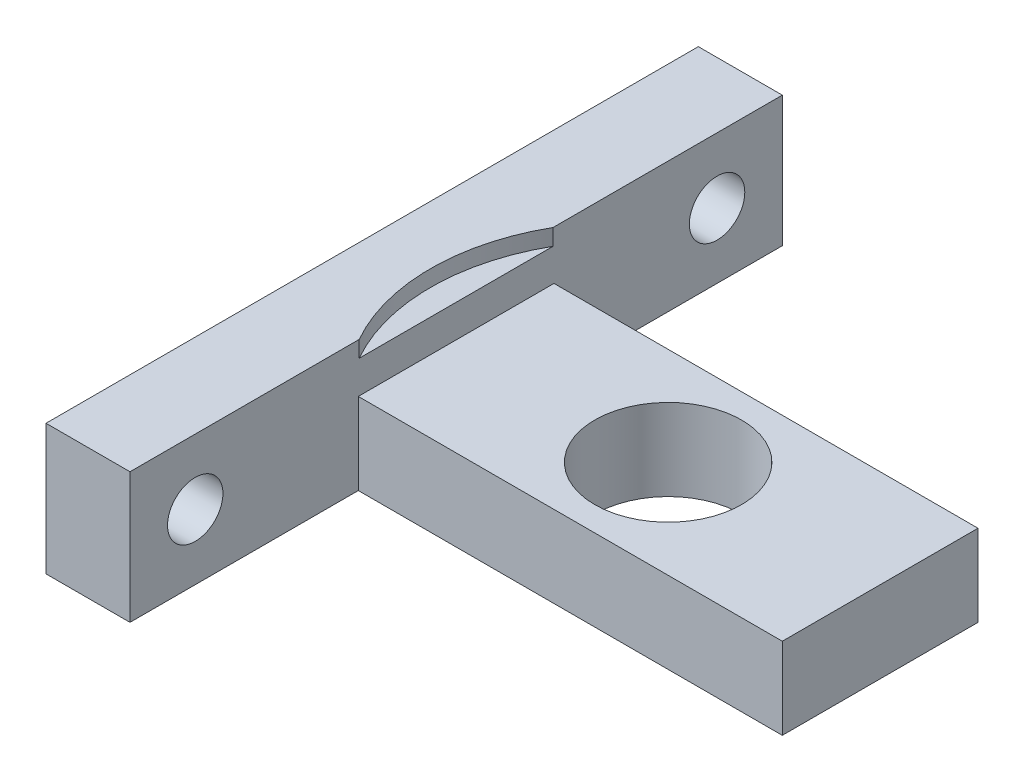
ISO-10303-21;
HEADER;
FILE_DESCRIPTION(('STEP AP214'),'2;1');
FILE_NAME('part.step','',(''),(''),'','','');
FILE_SCHEMA(('AUTOMOTIVE_DESIGN { 1 0 10303 214 1 1 1 1 }'));
ENDSEC;
DATA;
#1=APPLICATION_CONTEXT('core data for automotive mechanical design processes');
#2=APPLICATION_PROTOCOL_DEFINITION('international standard','automotive_design',2000,#1);
#3=PRODUCT_CONTEXT('',#1,'mechanical');
#4=PRODUCT('Part','Part','',(#3));
#5=PRODUCT_RELATED_PRODUCT_CATEGORY('part','',(#4));
#6=PRODUCT_DEFINITION_FORMATION('','',#4);
#7=PRODUCT_DEFINITION_CONTEXT('part definition',#1,'design');
#8=PRODUCT_DEFINITION('design','',#6,#7);
#9=PRODUCT_DEFINITION_SHAPE('','',#8);
#10=(LENGTH_UNIT() NAMED_UNIT(*) SI_UNIT(.MILLI.,.METRE.));
#11=(NAMED_UNIT(*) PLANE_ANGLE_UNIT() SI_UNIT($,.RADIAN.));
#12=(NAMED_UNIT(*) SI_UNIT($,.STERADIAN.) SOLID_ANGLE_UNIT());
#13=UNCERTAINTY_MEASURE_WITH_UNIT(LENGTH_MEASURE(1.E-05),#10,'distance_accuracy_value','');
#14=(GEOMETRIC_REPRESENTATION_CONTEXT(3) GLOBAL_UNCERTAINTY_ASSIGNED_CONTEXT((#13)) GLOBAL_UNIT_ASSIGNED_CONTEXT((#10,
#11,#12)) REPRESENTATION_CONTEXT('',''));
#15=CARTESIAN_POINT('',(0.,0.,0.));
#16=DIRECTION('',(0.,0.,1.));
#17=DIRECTION('',(1.,0.,0.));
#18=AXIS2_PLACEMENT_3D('',#15,#16,#17);
#19=CARTESIAN_POINT('',(-2.57499999999999,-8.00000000000001,20.));
#20=DIRECTION('',(-1.,0.,0.));
#21=DIRECTION('',(0.,0.,1.));
#22=AXIS2_PLACEMENT_3D('',#19,#20,#21);
#23=PLANE('',#22);
#24=CARTESIAN_POINT('',(-2.57499999999999,-4.,16.));
#25=DIRECTION('',(-1.,0.,0.));
#26=DIRECTION('',(0.,0.,1.));
#27=AXIS2_PLACEMENT_3D('',#24,#25,#26);
#28=CIRCLE('',#27,1.7);
#29=CARTESIAN_POINT('',(-2.57499999999999,-4.,17.7));
#30=VERTEX_POINT('',#29);
#31=EDGE_CURVE('E194',#30,#30,#28,.T.);
#32=ORIENTED_EDGE('',*,*,#31,.F.);
#33=EDGE_LOOP('',(#32));
#34=FACE_BOUND('',#33,.T.);
#35=CARTESIAN_POINT('',(-2.57499999999999,-4.,-16.));
#36=DIRECTION('',(-1.,0.,0.));
#37=DIRECTION('',(0.,0.,1.));
#38=AXIS2_PLACEMENT_3D('',#35,#36,#37);
#39=CIRCLE('',#38,1.7);
#40=CARTESIAN_POINT('',(-2.57499999999999,-4.,-14.3));
#41=VERTEX_POINT('',#40);
#42=EDGE_CURVE('E187',#41,#41,#39,.T.);
#43=ORIENTED_EDGE('',*,*,#42,.F.);
#44=EDGE_LOOP('',(#43));
#45=FACE_BOUND('',#44,.T.);
#46=DIRECTION('',(0.,0.,1.));
#47=VECTOR('',#46,1.);
#48=CARTESIAN_POINT('',(-2.57499999999999,0.,20.));
#49=LINE('',#48,#47);
#50=CARTESIAN_POINT('',(-2.57499999999999,0.,-20.));
#51=VERTEX_POINT('',#50);
#52=CARTESIAN_POINT('',(-2.57499999999999,0.,20.));
#53=VERTEX_POINT('',#52);
#54=EDGE_CURVE('E198',#51,#53,#49,.T.);
#55=ORIENTED_EDGE('',*,*,#54,.F.);
#56=DIRECTION('',(0.,1.,0.));
#57=VECTOR('',#56,1.);
#58=CARTESIAN_POINT('',(-2.57499999999999,-8.00000000000001,-20.));
#59=LINE('',#58,#57);
#60=CARTESIAN_POINT('',(-2.57499999999999,-8.00000000000001,-20.));
#61=VERTEX_POINT('',#60);
#62=EDGE_CURVE('E48',#61,#51,#59,.T.);
#63=ORIENTED_EDGE('',*,*,#62,.F.);
#64=DIRECTION('',(0.,0.,1.));
#65=VECTOR('',#64,1.);
#66=CARTESIAN_POINT('',(-2.57499999999999,-8.00000000000001,20.));
#67=LINE('',#66,#65);
#68=CARTESIAN_POINT('',(-2.57499999999999,-8.00000000000001,20.));
#69=VERTEX_POINT('',#68);
#70=EDGE_CURVE('E199',#61,#69,#67,.T.);
#71=ORIENTED_EDGE('',*,*,#70,.T.);
#72=DIRECTION('',(0.,1.,0.));
#73=VECTOR('',#72,1.);
#74=CARTESIAN_POINT('',(-2.57499999999999,-8.00000000000001,20.));
#75=LINE('',#74,#73);
#76=EDGE_CURVE('E217',#69,#53,#75,.T.);
#77=ORIENTED_EDGE('',*,*,#76,.T.);
#78=EDGE_LOOP('',(#55,#63,#71,#77));
#79=FACE_BOUND('',#78,.T.);
#80=ADVANCED_FACE('F40',(#34,#45,#79),#23,.T.);
#81=CARTESIAN_POINT('',(2.57500000000001,-8.00000000000001,-20.));
#82=DIRECTION('',(0.,0.,-1.));
#83=DIRECTION('',(-1.,0.,0.));
#84=AXIS2_PLACEMENT_3D('',#81,#82,#83);
#85=PLANE('',#84);
#86=DIRECTION('',(-1.,0.,0.));
#87=VECTOR('',#86,1.);
#88=CARTESIAN_POINT('',(2.57500000000001,0.,-20.));
#89=LINE('',#88,#87);
#90=CARTESIAN_POINT('',(2.57500000000001,0.,-20.));
#91=VERTEX_POINT('',#90);
#92=EDGE_CURVE('E204',#91,#51,#89,.T.);
#93=ORIENTED_EDGE('',*,*,#92,.F.);
#94=DIRECTION('',(0.,1.,0.));
#95=VECTOR('',#94,1.);
#96=CARTESIAN_POINT('',(2.57500000000001,-8.00000000000001,-20.));
#97=LINE('',#96,#95);
#98=CARTESIAN_POINT('',(2.57500000000001,-8.00000000000001,-20.));
#99=VERTEX_POINT('',#98);
#100=EDGE_CURVE('E234',#99,#91,#97,.T.);
#101=ORIENTED_EDGE('',*,*,#100,.F.);
#102=DIRECTION('',(-1.,0.,0.));
#103=VECTOR('',#102,1.);
#104=CARTESIAN_POINT('',(2.57500000000001,-8.00000000000001,-20.));
#105=LINE('',#104,#103);
#106=EDGE_CURVE('E213',#99,#61,#105,.T.);
#107=ORIENTED_EDGE('',*,*,#106,.T.);
#108=ORIENTED_EDGE('',*,*,#62,.T.);
#109=EDGE_LOOP('',(#93,#101,#107,#108));
#110=FACE_BOUND('',#109,.T.);
#111=ADVANCED_FACE('F254',(#110),#85,.T.);
#112=CARTESIAN_POINT('',(2.57500000000001,-8.00000000000001,20.));
#113=DIRECTION('',(1.,0.,0.));
#114=DIRECTION('',(0.,0.,-1.));
#115=AXIS2_PLACEMENT_3D('',#112,#113,#114);
#116=PLANE('',#115);
#117=DIRECTION('',(0.,1.,0.));
#118=VECTOR('',#117,1.);
#119=CARTESIAN_POINT('',(2.57500000000001,-1.,-5.94301060069727));
#120=LINE('',#119,#118);
#121=CARTESIAN_POINT('',(2.57500000000001,-1.,-5.94301060069727));
#122=VERTEX_POINT('',#121);
#123=CARTESIAN_POINT('',(2.57500000000001,0.,-5.94301060069727));
#124=VERTEX_POINT('',#123);
#125=EDGE_CURVE('E55',#122,#124,#120,.T.);
#126=ORIENTED_EDGE('',*,*,#125,.F.);
#127=DIRECTION('',(0.,0.,1.));
#128=VECTOR('',#127,1.);
#129=CARTESIAN_POINT('',(2.57500000000001,-1.,20.));
#130=LINE('',#129,#128);
#131=CARTESIAN_POINT('',(2.57500000000001,-1.,5.94301060069727));
#132=VERTEX_POINT('',#131);
#133=EDGE_CURVE('E11',#122,#132,#130,.T.);
#134=ORIENTED_EDGE('',*,*,#133,.T.);
#135=DIRECTION('',(0.,1.,0.));
#136=VECTOR('',#135,1.);
#137=CARTESIAN_POINT('',(2.57500000000001,-1.,5.94301060069727));
#138=LINE('',#137,#136);
#139=CARTESIAN_POINT('',(2.57500000000001,0.,5.94301060069727));
#140=VERTEX_POINT('',#139);
#141=EDGE_CURVE('E123',#140,#132,#138,.F.);
#142=ORIENTED_EDGE('',*,*,#141,.F.);
#143=DIRECTION('',(0.,0.,-1.));
#144=VECTOR('',#143,1.);
#145=CARTESIAN_POINT('',(2.57500000000001,0.,20.));
#146=LINE('',#145,#144);
#147=CARTESIAN_POINT('',(2.57500000000001,0.,20.));
#148=VERTEX_POINT('',#147);
#149=EDGE_CURVE('E225',#148,#140,#146,.T.);
#150=ORIENTED_EDGE('',*,*,#149,.F.);
#151=DIRECTION('',(0.,1.,0.));
#152=VECTOR('',#151,1.);
#153=CARTESIAN_POINT('',(2.57500000000001,-8.00000000000001,20.));
#154=LINE('',#153,#152);
#155=CARTESIAN_POINT('',(2.57500000000001,-8.00000000000001,20.));
#156=VERTEX_POINT('',#155);
#157=EDGE_CURVE('E237',#156,#148,#154,.T.);
#158=ORIENTED_EDGE('',*,*,#157,.F.);
#159=DIRECTION('',(0.,0.,-1.));
#160=VECTOR('',#159,1.);
#161=CARTESIAN_POINT('',(2.57500000000001,-8.00000000000001,20.));
#162=LINE('',#161,#160);
#163=CARTESIAN_POINT('',(2.57500000000001,-8.00000000000001,6.00000000000001));
#164=VERTEX_POINT('',#163);
#165=EDGE_CURVE('E209',#156,#164,#162,.T.);
#166=ORIENTED_EDGE('',*,*,#165,.T.);
#167=DIRECTION('',(0.,-1.,0.));
#168=VECTOR('',#167,1.);
#169=CARTESIAN_POINT('',(2.57500000000001,-3.,6.00000000000001));
#170=LINE('',#169,#168);
#171=CARTESIAN_POINT('',(2.57500000000001,-3.,6.00000000000001));
#172=VERTEX_POINT('',#171);
#173=EDGE_CURVE('E173',#172,#164,#170,.T.);
#174=ORIENTED_EDGE('',*,*,#173,.F.);
#175=DIRECTION('',(0.,0.,1.));
#176=VECTOR('',#175,1.);
#177=CARTESIAN_POINT('',(2.57500000000001,-3.,-6.00000000000001));
#178=LINE('',#177,#176);
#179=CARTESIAN_POINT('',(2.57500000000001,-3.,-6.00000000000001));
#180=VERTEX_POINT('',#179);
#181=EDGE_CURVE('E156',#180,#172,#178,.T.);
#182=ORIENTED_EDGE('',*,*,#181,.F.);
#183=DIRECTION('',(0.,-1.,0.));
#184=VECTOR('',#183,1.);
#185=CARTESIAN_POINT('',(2.57500000000001,-3.,-6.00000000000001));
#186=LINE('',#185,#184);
#187=CARTESIAN_POINT('',(2.57500000000001,-8.00000000000001,-6.00000000000001));
#188=VERTEX_POINT('',#187);
#189=EDGE_CURVE('E176',#180,#188,#186,.T.);
#190=ORIENTED_EDGE('',*,*,#189,.T.);
#191=EDGE_CURVE('E208',#188,#99,#162,.T.);
#192=ORIENTED_EDGE('',*,*,#191,.T.);
#193=ORIENTED_EDGE('',*,*,#100,.T.);
#194=EDGE_CURVE('E131',#124,#91,#146,.T.);
#195=ORIENTED_EDGE('',*,*,#194,.F.);
#196=EDGE_LOOP('',(#126,#134,#142,#150,#158,#166,#174,#182,#190,#192,#193,#195));
#197=FACE_BOUND('',#196,.T.);
#198=CARTESIAN_POINT('',(2.57500000000001,-4.,16.));
#199=DIRECTION('',(1.,0.,0.));
#200=DIRECTION('',(0.,0.,-1.));
#201=AXIS2_PLACEMENT_3D('',#198,#199,#200);
#202=CIRCLE('',#201,1.7);
#203=CARTESIAN_POINT('',(2.57500000000001,-4.,14.3));
#204=VERTEX_POINT('',#203);
#205=EDGE_CURVE('E183',#204,#204,#202,.T.);
#206=ORIENTED_EDGE('',*,*,#205,.F.);
#207=EDGE_LOOP('',(#206));
#208=FACE_BOUND('',#207,.T.);
#209=CARTESIAN_POINT('',(2.57500000000001,-4.,-16.));
#210=DIRECTION('',(1.,0.,0.));
#211=DIRECTION('',(0.,0.,-1.));
#212=AXIS2_PLACEMENT_3D('',#209,#210,#211);
#213=CIRCLE('',#212,1.7);
#214=CARTESIAN_POINT('',(2.57500000000001,-4.,-17.7));
#215=VERTEX_POINT('',#214);
#216=EDGE_CURVE('E182',#215,#215,#213,.T.);
#217=ORIENTED_EDGE('',*,*,#216,.F.);
#218=EDGE_LOOP('',(#217));
#219=FACE_BOUND('',#218,.T.);
#220=ADVANCED_FACE('F128',(#197,#208,#219),#116,.T.);
#221=CARTESIAN_POINT('',(2.57500000000001,-8.00000000000001,20.));
#222=DIRECTION('',(0.,0.,1.));
#223=DIRECTION('',(1.,0.,0.));
#224=AXIS2_PLACEMENT_3D('',#221,#222,#223);
#225=PLANE('',#224);
#226=DIRECTION('',(1.,0.,0.));
#227=VECTOR('',#226,1.);
#228=CARTESIAN_POINT('',(2.57500000000001,0.,20.));
#229=LINE('',#228,#227);
#230=EDGE_CURVE('E221',#53,#148,#229,.T.);
#231=ORIENTED_EDGE('',*,*,#230,.F.);
#232=ORIENTED_EDGE('',*,*,#76,.F.);
#233=DIRECTION('',(1.,0.,0.));
#234=VECTOR('',#233,1.);
#235=CARTESIAN_POINT('',(2.57500000000001,-8.00000000000001,20.));
#236=LINE('',#235,#234);
#237=EDGE_CURVE('E203',#69,#156,#236,.T.);
#238=ORIENTED_EDGE('',*,*,#237,.T.);
#239=ORIENTED_EDGE('',*,*,#157,.T.);
#240=EDGE_LOOP('',(#231,#232,#238,#239));
#241=FACE_BOUND('',#240,.T.);
#242=ADVANCED_FACE('F247',(#241),#225,.T.);
#243=CARTESIAN_POINT('',(0.,-8.00000000000001,0.));
#244=DIRECTION('',(0.,1.,0.));
#245=DIRECTION('',(0.,0.,1.));
#246=AXIS2_PLACEMENT_3D('',#243,#244,#245);
#247=PLANE('',#246);
#248=ORIENTED_EDGE('',*,*,#70,.F.);
#249=ORIENTED_EDGE('',*,*,#106,.F.);
#250=ORIENTED_EDGE('',*,*,#191,.F.);
#251=DIRECTION('',(-1.,0.,0.));
#252=VECTOR('',#251,1.);
#253=CARTESIAN_POINT('',(2.57500000000001,-8.00000000000001,-6.00000000000001));
#254=LINE('',#253,#252);
#255=CARTESIAN_POINT('',(28.575,-8.00000000000001,-6.00000000000001));
#256=VERTEX_POINT('',#255);
#257=EDGE_CURVE('E63',#256,#188,#254,.T.);
#258=ORIENTED_EDGE('',*,*,#257,.F.);
#259=DIRECTION('',(0.,0.,-1.));
#260=VECTOR('',#259,1.);
#261=CARTESIAN_POINT('',(28.575,-8.00000000000001,-6.00000000000001));
#262=LINE('',#261,#260);
#263=CARTESIAN_POINT('',(28.575,-8.00000000000001,6.00000000000001));
#264=VERTEX_POINT('',#263);
#265=EDGE_CURVE('E146',#264,#256,#262,.T.);
#266=ORIENTED_EDGE('',*,*,#265,.F.);
#267=DIRECTION('',(1.,0.,0.));
#268=VECTOR('',#267,1.);
#269=CARTESIAN_POINT('',(2.57500000000001,-8.00000000000001,6.00000000000001));
#270=LINE('',#269,#268);
#271=EDGE_CURVE('E153',#164,#264,#270,.T.);
#272=ORIENTED_EDGE('',*,*,#271,.F.);
#273=ORIENTED_EDGE('',*,*,#165,.F.);
#274=ORIENTED_EDGE('',*,*,#237,.F.);
#275=EDGE_LOOP('',(#248,#249,#250,#258,#266,#272,#273,#274));
#276=FACE_BOUND('',#275,.T.);
#277=CARTESIAN_POINT('',(15.575,-8.00000000000001,0.));
#278=DIRECTION('',(0.,1.,0.));
#279=DIRECTION('',(0.,0.,1.));
#280=AXIS2_PLACEMENT_3D('',#277,#278,#279);
#281=CIRCLE('',#280,4.5);
#282=CARTESIAN_POINT('',(15.575,-8.00000000000001,4.5));
#283=VERTEX_POINT('',#282);
#284=EDGE_CURVE('E133',#283,#283,#281,.T.);
#285=ORIENTED_EDGE('',*,*,#284,.T.);
#286=EDGE_LOOP('',(#285));
#287=FACE_BOUND('',#286,.T.);
#288=ADVANCED_FACE('F257',(#276,#287),#247,.F.);
#289=CARTESIAN_POINT('',(0.,0.,0.));
#290=DIRECTION('',(0.,1.,0.));
#291=DIRECTION('',(0.,0.,1.));
#292=AXIS2_PLACEMENT_3D('',#289,#290,#291);
#293=PLANE('',#292);
#294=CARTESIAN_POINT('',(13.,0.,0.));
#295=DIRECTION('',(0.,1.,0.));
#296=DIRECTION('',(0.,0.,1.));
#297=AXIS2_PLACEMENT_3D('',#294,#295,#296);
#298=CIRCLE('',#297,12.);
#299=EDGE_CURVE('E125',#124,#140,#298,.T.);
#300=ORIENTED_EDGE('',*,*,#299,.F.);
#301=ORIENTED_EDGE('',*,*,#194,.T.);
#302=ORIENTED_EDGE('',*,*,#92,.T.);
#303=ORIENTED_EDGE('',*,*,#54,.T.);
#304=ORIENTED_EDGE('',*,*,#230,.T.);
#305=ORIENTED_EDGE('',*,*,#149,.T.);
#306=EDGE_LOOP('',(#300,#301,#302,#303,#304,#305));
#307=FACE_BOUND('',#306,.T.);
#308=ADVANCED_FACE('F250',(#307),#293,.T.);
#309=CARTESIAN_POINT('',(-8.425,-4.,-16.));
#310=DIRECTION('',(1.,0.,0.));
#311=DIRECTION('',(0.,0.,-1.));
#312=AXIS2_PLACEMENT_3D('',#309,#310,#311);
#313=CYLINDRICAL_SURFACE('',#312,1.7);
#314=ORIENTED_EDGE('',*,*,#42,.T.);
#315=EDGE_LOOP('',(#314));
#316=FACE_BOUND('',#315,.T.);
#317=ORIENTED_EDGE('',*,*,#216,.T.);
#318=EDGE_LOOP('',(#317));
#319=FACE_BOUND('',#318,.T.);
#320=ADVANCED_FACE('F330',(#316,#319),#313,.F.);
#321=CARTESIAN_POINT('',(-8.425,-4.,16.));
#322=DIRECTION('',(1.,0.,0.));
#323=DIRECTION('',(0.,0.,-1.));
#324=AXIS2_PLACEMENT_3D('',#321,#322,#323);
#325=CYLINDRICAL_SURFACE('',#324,1.7);
#326=ORIENTED_EDGE('',*,*,#31,.T.);
#327=EDGE_LOOP('',(#326));
#328=FACE_BOUND('',#327,.T.);
#329=ORIENTED_EDGE('',*,*,#205,.T.);
#330=EDGE_LOOP('',(#329));
#331=FACE_BOUND('',#330,.T.);
#332=ADVANCED_FACE('F317',(#328,#331),#325,.F.);
#333=CARTESIAN_POINT('',(0.,-3.,0.));
#334=DIRECTION('',(0.,1.,0.));
#335=DIRECTION('',(0.,0.,1.));
#336=AXIS2_PLACEMENT_3D('',#333,#334,#335);
#337=PLANE('',#336);
#338=DIRECTION('',(0.,0.,-1.));
#339=VECTOR('',#338,1.);
#340=CARTESIAN_POINT('',(28.575,-3.,-6.00000000000001));
#341=LINE('',#340,#339);
#342=CARTESIAN_POINT('',(28.575,-3.,6.00000000000001));
#343=VERTEX_POINT('',#342);
#344=CARTESIAN_POINT('',(28.575,-3.,-6.00000000000001));
#345=VERTEX_POINT('',#344);
#346=EDGE_CURVE('E148',#343,#345,#341,.T.);
#347=ORIENTED_EDGE('',*,*,#346,.T.);
#348=DIRECTION('',(-1.,0.,0.));
#349=VECTOR('',#348,1.);
#350=CARTESIAN_POINT('',(2.57500000000001,-3.,-6.00000000000001));
#351=LINE('',#350,#349);
#352=EDGE_CURVE('E152',#345,#180,#351,.T.);
#353=ORIENTED_EDGE('',*,*,#352,.T.);
#354=ORIENTED_EDGE('',*,*,#181,.T.);
#355=DIRECTION('',(1.,0.,0.));
#356=VECTOR('',#355,1.);
#357=CARTESIAN_POINT('',(2.57500000000001,-3.,6.00000000000001));
#358=LINE('',#357,#356);
#359=EDGE_CURVE('E159',#172,#343,#358,.T.);
#360=ORIENTED_EDGE('',*,*,#359,.T.);
#361=EDGE_LOOP('',(#347,#353,#354,#360));
#362=FACE_BOUND('',#361,.T.);
#363=CARTESIAN_POINT('',(15.575,-3.,0.));
#364=DIRECTION('',(0.,1.,0.));
#365=DIRECTION('',(0.,0.,1.));
#366=AXIS2_PLACEMENT_3D('',#363,#364,#365);
#367=CIRCLE('',#366,4.5);
#368=CARTESIAN_POINT('',(15.575,-3.,4.5));
#369=VERTEX_POINT('',#368);
#370=EDGE_CURVE('E139',#369,#369,#367,.T.);
#371=ORIENTED_EDGE('',*,*,#370,.F.);
#372=EDGE_LOOP('',(#371));
#373=FACE_BOUND('',#372,.T.);
#374=ADVANCED_FACE('F275',(#362,#373),#337,.T.);
#375=CARTESIAN_POINT('',(28.575,-3.,-6.00000000000001));
#376=DIRECTION('',(-1.,0.,0.));
#377=DIRECTION('',(0.,0.,1.));
#378=AXIS2_PLACEMENT_3D('',#375,#376,#377);
#379=PLANE('',#378);
#380=ORIENTED_EDGE('',*,*,#265,.T.);
#381=DIRECTION('',(0.,-1.,0.));
#382=VECTOR('',#381,1.);
#383=CARTESIAN_POINT('',(28.575,-3.,-6.00000000000001));
#384=LINE('',#383,#382);
#385=EDGE_CURVE('E179',#345,#256,#384,.T.);
#386=ORIENTED_EDGE('',*,*,#385,.F.);
#387=ORIENTED_EDGE('',*,*,#346,.F.);
#388=DIRECTION('',(0.,-1.,0.));
#389=VECTOR('',#388,1.);
#390=CARTESIAN_POINT('',(28.575,-3.,6.00000000000001));
#391=LINE('',#390,#389);
#392=EDGE_CURVE('E162',#343,#264,#391,.T.);
#393=ORIENTED_EDGE('',*,*,#392,.T.);
#394=EDGE_LOOP('',(#380,#386,#387,#393));
#395=FACE_BOUND('',#394,.T.);
#396=ADVANCED_FACE('F309',(#395),#379,.F.);
#397=CARTESIAN_POINT('',(2.57500000000001,-3.,-6.00000000000001));
#398=DIRECTION('',(0.,0.,1.));
#399=DIRECTION('',(1.,0.,0.));
#400=AXIS2_PLACEMENT_3D('',#397,#398,#399);
#401=PLANE('',#400);
#402=ORIENTED_EDGE('',*,*,#257,.T.);
#403=ORIENTED_EDGE('',*,*,#189,.F.);
#404=ORIENTED_EDGE('',*,*,#352,.F.);
#405=ORIENTED_EDGE('',*,*,#385,.T.);
#406=EDGE_LOOP('',(#402,#403,#404,#405));
#407=FACE_BOUND('',#406,.T.);
#408=ADVANCED_FACE('F278',(#407),#401,.F.);
#409=CARTESIAN_POINT('',(2.57500000000001,-3.,6.00000000000001));
#410=DIRECTION('',(0.,0.,-1.));
#411=DIRECTION('',(-1.,0.,0.));
#412=AXIS2_PLACEMENT_3D('',#409,#410,#411);
#413=PLANE('',#412);
#414=ORIENTED_EDGE('',*,*,#271,.T.);
#415=ORIENTED_EDGE('',*,*,#392,.F.);
#416=ORIENTED_EDGE('',*,*,#359,.F.);
#417=ORIENTED_EDGE('',*,*,#173,.T.);
#418=EDGE_LOOP('',(#414,#415,#416,#417));
#419=FACE_BOUND('',#418,.T.);
#420=ADVANCED_FACE('F271',(#419),#413,.F.);
#421=CARTESIAN_POINT('',(15.575,-3.,0.));
#422=DIRECTION('',(0.,-1.,0.));
#423=DIRECTION('',(0.,0.,-1.));
#424=AXIS2_PLACEMENT_3D('',#421,#422,#423);
#425=CYLINDRICAL_SURFACE('',#424,4.5);
#426=ORIENTED_EDGE('',*,*,#370,.T.);
#427=EDGE_LOOP('',(#426));
#428=FACE_BOUND('',#427,.T.);
#429=ORIENTED_EDGE('',*,*,#284,.F.);
#430=EDGE_LOOP('',(#429));
#431=FACE_BOUND('',#430,.T.);
#432=ADVANCED_FACE('F377',(#428,#431),#425,.F.);
#433=CARTESIAN_POINT('',(13.,-1.,0.));
#434=DIRECTION('',(0.,1.,0.));
#435=DIRECTION('',(0.,0.,1.));
#436=AXIS2_PLACEMENT_3D('',#433,#434,#435);
#437=CYLINDRICAL_SURFACE('',#436,12.);
#438=ORIENTED_EDGE('',*,*,#125,.T.);
#439=ORIENTED_EDGE('',*,*,#299,.T.);
#440=ORIENTED_EDGE('',*,*,#141,.T.);
#441=CARTESIAN_POINT('',(13.,-1.,0.));
#442=DIRECTION('',(0.,1.,0.));
#443=DIRECTION('',(0.,0.,1.));
#444=AXIS2_PLACEMENT_3D('',#441,#442,#443);
#445=CIRCLE('',#444,12.);
#446=EDGE_CURVE('E119',#122,#132,#445,.T.);
#447=ORIENTED_EDGE('',*,*,#446,.F.);
#448=EDGE_LOOP('',(#438,#439,#440,#447));
#449=FACE_BOUND('',#448,.T.);
#450=ADVANCED_FACE('F122',(#449),#437,.F.);
#451=CARTESIAN_POINT('',(13.,-1.,0.));
#452=DIRECTION('',(0.,1.,0.));
#453=DIRECTION('',(0.,0.,1.));
#454=AXIS2_PLACEMENT_3D('',#451,#452,#453);
#455=PLANE('',#454);
#456=ORIENTED_EDGE('',*,*,#446,.T.);
#457=ORIENTED_EDGE('',*,*,#133,.F.);
#458=EDGE_LOOP('',(#456,#457));
#459=FACE_BOUND('',#458,.T.);
#460=ADVANCED_FACE('F118',(#459),#455,.T.);
#461=CLOSED_SHELL('',(#80,#111,#220,#242,#288,#308,#320,#332,#374,#396,#408,#420,#432,#450,#460));
#462=MANIFOLD_SOLID_BREP('B2',#461);
#463=ADVANCED_BREP_SHAPE_REPRESENTATION('',(#18,#462),#14);
#464=SHAPE_DEFINITION_REPRESENTATION(#9,#463);
ENDSEC;
END-ISO-10303-21;
